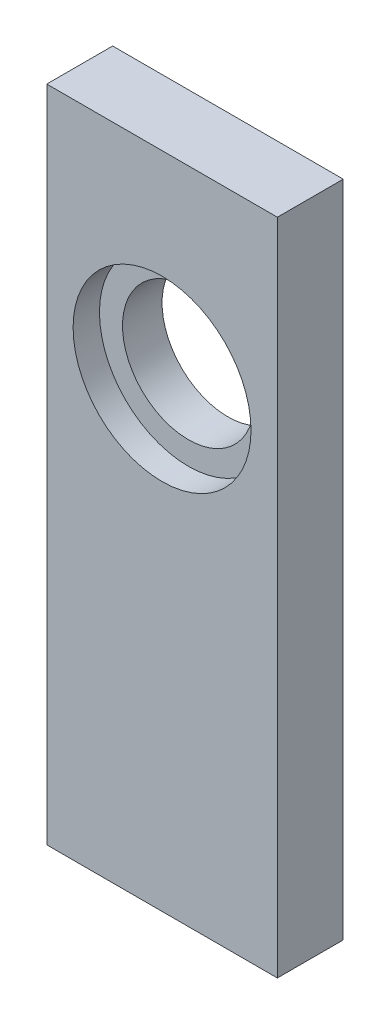
ISO-10303-21;
HEADER;
FILE_DESCRIPTION(('STEP AP214'),'2;1');
FILE_NAME('part.step','',(''),(''),'','','');
FILE_SCHEMA(('AUTOMOTIVE_DESIGN { 1 0 10303 214 1 1 1 1 }'));
ENDSEC;
DATA;
#1=APPLICATION_CONTEXT('core data for automotive mechanical design processes');
#2=APPLICATION_PROTOCOL_DEFINITION('international standard','automotive_design',2000,#1);
#3=PRODUCT_CONTEXT('',#1,'mechanical');
#4=PRODUCT('Part','Part','',(#3));
#5=PRODUCT_RELATED_PRODUCT_CATEGORY('part','',(#4));
#6=PRODUCT_DEFINITION_FORMATION('','',#4);
#7=PRODUCT_DEFINITION_CONTEXT('part definition',#1,'design');
#8=PRODUCT_DEFINITION('design','',#6,#7);
#9=PRODUCT_DEFINITION_SHAPE('','',#8);
#10=(LENGTH_UNIT() NAMED_UNIT(*) SI_UNIT(.MILLI.,.METRE.));
#11=(NAMED_UNIT(*) PLANE_ANGLE_UNIT() SI_UNIT($,.RADIAN.));
#12=(NAMED_UNIT(*) SI_UNIT($,.STERADIAN.) SOLID_ANGLE_UNIT());
#13=UNCERTAINTY_MEASURE_WITH_UNIT(LENGTH_MEASURE(1.E-05),#10,'distance_accuracy_value','');
#14=(GEOMETRIC_REPRESENTATION_CONTEXT(3) GLOBAL_UNCERTAINTY_ASSIGNED_CONTEXT((#13)) GLOBAL_UNIT_ASSIGNED_CONTEXT((#10,
#11,#12)) REPRESENTATION_CONTEXT('',''));
#15=CARTESIAN_POINT('',(0.,0.,0.));
#16=DIRECTION('',(0.,0.,1.));
#17=DIRECTION('',(1.,0.,0.));
#18=AXIS2_PLACEMENT_3D('',#15,#16,#17);
#19=CARTESIAN_POINT('',(-17.5,-25.,10.));
#20=DIRECTION('',(0.,1.,0.));
#21=DIRECTION('',(0.,0.,1.));
#22=AXIS2_PLACEMENT_3D('',#19,#20,#21);
#23=PLANE('',#22);
#24=DIRECTION('',(1.,0.,0.));
#25=VECTOR('',#24,1.);
#26=CARTESIAN_POINT('',(-17.5,-25.,0.));
#27=LINE('',#26,#25);
#28=CARTESIAN_POINT('',(-17.5,-25.,0.));
#29=VERTEX_POINT('',#28);
#30=CARTESIAN_POINT('',(17.5,-25.,0.));
#31=VERTEX_POINT('',#30);
#32=EDGE_CURVE('E95',#29,#31,#27,.T.);
#33=ORIENTED_EDGE('',*,*,#32,.T.);
#34=DIRECTION('',(0.,0.,-1.));
#35=VECTOR('',#34,1.);
#36=CARTESIAN_POINT('',(17.5,-25.,10.));
#37=LINE('',#36,#35);
#38=CARTESIAN_POINT('',(17.5,-25.,10.));
#39=VERTEX_POINT('',#38);
#40=EDGE_CURVE('E48',#39,#31,#37,.T.);
#41=ORIENTED_EDGE('',*,*,#40,.F.);
#42=DIRECTION('',(1.,0.,0.));
#43=VECTOR('',#42,1.);
#44=CARTESIAN_POINT('',(-17.5,-25.,10.));
#45=LINE('',#44,#43);
#46=CARTESIAN_POINT('',(-17.5,-25.,10.));
#47=VERTEX_POINT('',#46);
#48=EDGE_CURVE('E87',#47,#39,#45,.T.);
#49=ORIENTED_EDGE('',*,*,#48,.F.);
#50=DIRECTION('',(0.,0.,-1.));
#51=VECTOR('',#50,1.);
#52=CARTESIAN_POINT('',(-17.5,-25.,10.));
#53=LINE('',#52,#51);
#54=EDGE_CURVE('E11',#47,#29,#53,.T.);
#55=ORIENTED_EDGE('',*,*,#54,.T.);
#56=EDGE_LOOP('',(#33,#41,#49,#55));
#57=FACE_BOUND('',#56,.T.);
#58=ADVANCED_FACE('F39',(#57),#23,.F.);
#59=CARTESIAN_POINT('',(17.5,75.,10.));
#60=DIRECTION('',(-1.,0.,0.));
#61=DIRECTION('',(0.,-1.,0.));
#62=AXIS2_PLACEMENT_3D('',#59,#60,#61);
#63=PLANE('',#62);
#64=DIRECTION('',(0.,1.,0.));
#65=VECTOR('',#64,1.);
#66=CARTESIAN_POINT('',(17.5,75.,0.));
#67=LINE('',#66,#65);
#68=CARTESIAN_POINT('',(17.5,75.,0.));
#69=VERTEX_POINT('',#68);
#70=EDGE_CURVE('E74',#31,#69,#67,.T.);
#71=ORIENTED_EDGE('',*,*,#70,.T.);
#72=DIRECTION('',(0.,0.,-1.));
#73=VECTOR('',#72,1.);
#74=CARTESIAN_POINT('',(17.5,75.,10.));
#75=LINE('',#74,#73);
#76=CARTESIAN_POINT('',(17.5,75.,10.));
#77=VERTEX_POINT('',#76);
#78=EDGE_CURVE('E97',#77,#69,#75,.T.);
#79=ORIENTED_EDGE('',*,*,#78,.F.);
#80=DIRECTION('',(0.,1.,0.));
#81=VECTOR('',#80,1.);
#82=CARTESIAN_POINT('',(17.5,75.,10.));
#83=LINE('',#82,#81);
#84=EDGE_CURVE('E91',#39,#77,#83,.T.);
#85=ORIENTED_EDGE('',*,*,#84,.F.);
#86=ORIENTED_EDGE('',*,*,#40,.T.);
#87=EDGE_LOOP('',(#71,#79,#85,#86));
#88=FACE_BOUND('',#87,.T.);
#89=ADVANCED_FACE('F98',(#88),#63,.F.);
#90=CARTESIAN_POINT('',(-17.5,75.,10.));
#91=DIRECTION('',(0.,-1.,0.));
#92=DIRECTION('',(0.,0.,-1.));
#93=AXIS2_PLACEMENT_3D('',#90,#91,#92);
#94=PLANE('',#93);
#95=DIRECTION('',(-1.,0.,0.));
#96=VECTOR('',#95,1.);
#97=CARTESIAN_POINT('',(-17.5,75.,0.));
#98=LINE('',#97,#96);
#99=CARTESIAN_POINT('',(-17.5,75.,0.));
#100=VERTEX_POINT('',#99);
#101=EDGE_CURVE('E81',#69,#100,#98,.T.);
#102=ORIENTED_EDGE('',*,*,#101,.T.);
#103=DIRECTION('',(0.,0.,-1.));
#104=VECTOR('',#103,1.);
#105=CARTESIAN_POINT('',(-17.5,75.,10.));
#106=LINE('',#105,#104);
#107=CARTESIAN_POINT('',(-17.5,75.,10.));
#108=VERTEX_POINT('',#107);
#109=EDGE_CURVE('E104',#108,#100,#106,.T.);
#110=ORIENTED_EDGE('',*,*,#109,.F.);
#111=DIRECTION('',(-1.,0.,0.));
#112=VECTOR('',#111,1.);
#113=CARTESIAN_POINT('',(-17.5,75.,10.));
#114=LINE('',#113,#112);
#115=EDGE_CURVE('E101',#77,#108,#114,.T.);
#116=ORIENTED_EDGE('',*,*,#115,.F.);
#117=ORIENTED_EDGE('',*,*,#78,.T.);
#118=EDGE_LOOP('',(#102,#110,#116,#117));
#119=FACE_BOUND('',#118,.T.);
#120=ADVANCED_FACE('F121',(#119),#94,.F.);
#121=CARTESIAN_POINT('',(-17.5,25.,10.));
#122=DIRECTION('',(1.,0.,0.));
#123=DIRECTION('',(0.,1.,0.));
#124=AXIS2_PLACEMENT_3D('',#121,#122,#123);
#125=PLANE('',#124);
#126=DIRECTION('',(0.,-1.,0.));
#127=VECTOR('',#126,1.);
#128=CARTESIAN_POINT('',(-17.5,25.,0.));
#129=LINE('',#128,#127);
#130=EDGE_CURVE('E115',#100,#29,#129,.T.);
#131=ORIENTED_EDGE('',*,*,#130,.T.);
#132=ORIENTED_EDGE('',*,*,#54,.F.);
#133=DIRECTION('',(0.,-1.,0.));
#134=VECTOR('',#133,1.);
#135=CARTESIAN_POINT('',(-17.5,-25.,10.));
#136=LINE('',#135,#134);
#137=EDGE_CURVE('E56',#108,#47,#136,.T.);
#138=ORIENTED_EDGE('',*,*,#137,.F.);
#139=ORIENTED_EDGE('',*,*,#109,.T.);
#140=EDGE_LOOP('',(#131,#132,#138,#139));
#141=FACE_BOUND('',#140,.T.);
#142=ADVANCED_FACE('F125',(#141),#125,.F.);
#143=CARTESIAN_POINT('',(0.,0.,10.));
#144=DIRECTION('',(0.,0.,-1.));
#145=DIRECTION('',(-1.,0.,0.));
#146=AXIS2_PLACEMENT_3D('',#143,#144,#145);
#147=PLANE('',#146);
#148=CARTESIAN_POINT('',(0.,45.,10.));
#149=DIRECTION('',(0.,0.,1.));
#150=DIRECTION('',(1.,0.,0.));
#151=AXIS2_PLACEMENT_3D('',#148,#149,#150);
#152=CIRCLE('',#151,13.5);
#153=CARTESIAN_POINT('',(13.5,45.,10.));
#154=VERTEX_POINT('',#153);
#155=EDGE_CURVE('E209',#154,#154,#152,.T.);
#156=ORIENTED_EDGE('',*,*,#155,.F.);
#157=EDGE_LOOP('',(#156));
#158=FACE_BOUND('',#157,.T.);
#159=ORIENTED_EDGE('',*,*,#137,.T.);
#160=ORIENTED_EDGE('',*,*,#48,.T.);
#161=ORIENTED_EDGE('',*,*,#84,.T.);
#162=ORIENTED_EDGE('',*,*,#115,.T.);
#163=EDGE_LOOP('',(#159,#160,#161,#162));
#164=FACE_BOUND('',#163,.T.);
#165=ADVANCED_FACE('F89',(#158,#164),#147,.F.);
#166=CARTESIAN_POINT('',(0.,0.,0.));
#167=DIRECTION('',(0.,0.,-1.));
#168=DIRECTION('',(-1.,0.,0.));
#169=AXIS2_PLACEMENT_3D('',#166,#167,#168);
#170=PLANE('',#169);
#171=CARTESIAN_POINT('',(0.,45.,0.));
#172=DIRECTION('',(0.,0.,1.));
#173=DIRECTION('',(1.,0.,0.));
#174=AXIS2_PLACEMENT_3D('',#171,#172,#173);
#175=CIRCLE('',#174,10.);
#176=CARTESIAN_POINT('',(10.,45.,0.));
#177=VERTEX_POINT('',#176);
#178=EDGE_CURVE('E202',#177,#177,#175,.T.);
#179=ORIENTED_EDGE('',*,*,#178,.T.);
#180=EDGE_LOOP('',(#179));
#181=FACE_BOUND('',#180,.T.);
#182=ORIENTED_EDGE('',*,*,#32,.F.);
#183=ORIENTED_EDGE('',*,*,#130,.F.);
#184=ORIENTED_EDGE('',*,*,#101,.F.);
#185=ORIENTED_EDGE('',*,*,#70,.F.);
#186=EDGE_LOOP('',(#182,#183,#184,#185));
#187=FACE_BOUND('',#186,.T.);
#188=ADVANCED_FACE('F124',(#181,#187),#170,.T.);
#189=CARTESIAN_POINT('',(0.,45.,6.));
#190=DIRECTION('',(0.,0.,1.));
#191=DIRECTION('',(1.,0.,0.));
#192=AXIS2_PLACEMENT_3D('',#189,#190,#191);
#193=CYLINDRICAL_SURFACE('',#192,13.5);
#194=CARTESIAN_POINT('',(0.,45.,6.));
#195=DIRECTION('',(0.,0.,1.));
#196=DIRECTION('',(1.,0.,0.));
#197=AXIS2_PLACEMENT_3D('',#194,#195,#196);
#198=CIRCLE('',#197,13.5);
#199=CARTESIAN_POINT('',(13.5,45.,6.));
#200=VERTEX_POINT('',#199);
#201=EDGE_CURVE('E110',#200,#200,#198,.T.);
#202=ORIENTED_EDGE('',*,*,#201,.F.);
#203=EDGE_LOOP('',(#202));
#204=FACE_BOUND('',#203,.T.);
#205=ORIENTED_EDGE('',*,*,#155,.T.);
#206=EDGE_LOOP('',(#205));
#207=FACE_BOUND('',#206,.T.);
#208=ADVANCED_FACE('F164',(#204,#207),#193,.F.);
#209=CARTESIAN_POINT('',(0.,45.,6.));
#210=DIRECTION('',(0.,0.,1.));
#211=DIRECTION('',(1.,0.,0.));
#212=AXIS2_PLACEMENT_3D('',#209,#210,#211);
#213=PLANE('',#212);
#214=CARTESIAN_POINT('',(0.,45.,6.));
#215=DIRECTION('',(0.,0.,1.));
#216=DIRECTION('',(1.,0.,0.));
#217=AXIS2_PLACEMENT_3D('',#214,#215,#216);
#218=CIRCLE('',#217,10.);
#219=CARTESIAN_POINT('',(10.,45.,6.));
#220=VERTEX_POINT('',#219);
#221=EDGE_CURVE('E205',#220,#220,#218,.T.);
#222=ORIENTED_EDGE('',*,*,#221,.F.);
#223=EDGE_LOOP('',(#222));
#224=FACE_BOUND('',#223,.T.);
#225=ORIENTED_EDGE('',*,*,#201,.T.);
#226=EDGE_LOOP('',(#225));
#227=FACE_BOUND('',#226,.T.);
#228=ADVANCED_FACE('F169',(#224,#227),#213,.T.);
#229=CARTESIAN_POINT('',(0.,45.,0.));
#230=DIRECTION('',(0.,0.,1.));
#231=DIRECTION('',(1.,0.,0.));
#232=AXIS2_PLACEMENT_3D('',#229,#230,#231);
#233=CYLINDRICAL_SURFACE('',#232,10.);
#234=ORIENTED_EDGE('',*,*,#178,.F.);
#235=EDGE_LOOP('',(#234));
#236=FACE_BOUND('',#235,.T.);
#237=ORIENTED_EDGE('',*,*,#221,.T.);
#238=EDGE_LOOP('',(#237));
#239=FACE_BOUND('',#238,.T.);
#240=ADVANCED_FACE('F185',(#236,#239),#233,.F.);
#241=CLOSED_SHELL('',(#58,#89,#120,#142,#165,#188,#208,#228,#240));
#242=MANIFOLD_SOLID_BREP('B2',#241);
#243=ADVANCED_BREP_SHAPE_REPRESENTATION('',(#18,#242),#14);
#244=SHAPE_DEFINITION_REPRESENTATION(#9,#243);
ENDSEC;
END-ISO-10303-21;
